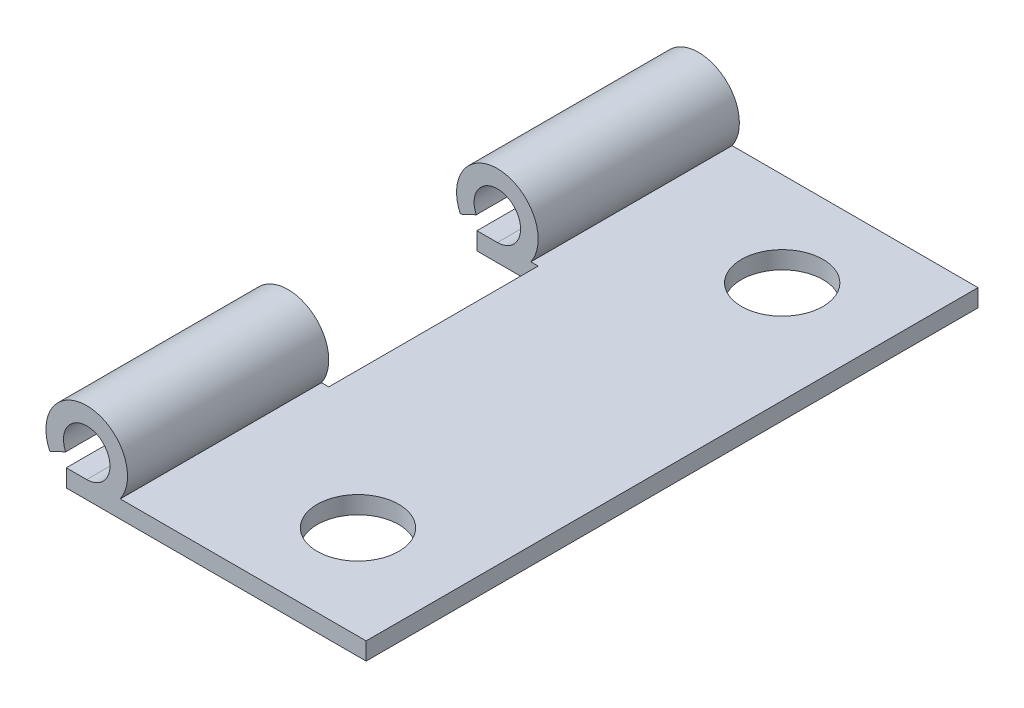
ISO-10303-21;
HEADER;
FILE_DESCRIPTION(('STEP AP214'),'2;1');
FILE_NAME('part.step','',(''),(''),'','','');
FILE_SCHEMA(('AUTOMOTIVE_DESIGN { 1 0 10303 214 1 1 1 1 }'));
ENDSEC;
DATA;
#1=APPLICATION_CONTEXT('core data for automotive mechanical design processes');
#2=APPLICATION_PROTOCOL_DEFINITION('international standard','automotive_design',2000,#1);
#3=PRODUCT_CONTEXT('',#1,'mechanical');
#4=PRODUCT('Part','Part','',(#3));
#5=PRODUCT_RELATED_PRODUCT_CATEGORY('part','',(#4));
#6=PRODUCT_DEFINITION_FORMATION('','',#4);
#7=PRODUCT_DEFINITION_CONTEXT('part definition',#1,'design');
#8=PRODUCT_DEFINITION('design','',#6,#7);
#9=PRODUCT_DEFINITION_SHAPE('','',#8);
#10=(LENGTH_UNIT() NAMED_UNIT(*) SI_UNIT(.MILLI.,.METRE.));
#11=(NAMED_UNIT(*) PLANE_ANGLE_UNIT() SI_UNIT($,.RADIAN.));
#12=(NAMED_UNIT(*) SI_UNIT($,.STERADIAN.) SOLID_ANGLE_UNIT());
#13=UNCERTAINTY_MEASURE_WITH_UNIT(LENGTH_MEASURE(1.E-05),#10,'distance_accuracy_value','');
#14=(GEOMETRIC_REPRESENTATION_CONTEXT(3) GLOBAL_UNCERTAINTY_ASSIGNED_CONTEXT((#13)) GLOBAL_UNIT_ASSIGNED_CONTEXT((#10,
#11,#12)) REPRESENTATION_CONTEXT('',''));
#15=CARTESIAN_POINT('',(0.,0.,0.));
#16=DIRECTION('',(0.,0.,1.));
#17=DIRECTION('',(1.,0.,0.));
#18=AXIS2_PLACEMENT_3D('',#15,#16,#17);
#19=CARTESIAN_POINT('',(0.,1.0922,0.));
#20=DIRECTION('',(0.,1.,0.));
#21=DIRECTION('',(0.,0.,1.));
#22=AXIS2_PLACEMENT_3D('',#19,#20,#21);
#23=PLANE('',#22);
#24=DIRECTION('',(1.,0.,0.));
#25=VECTOR('',#24,1.);
#26=CARTESIAN_POINT('',(0.,1.0922,-25.5693333333333));
#27=LINE('',#26,#25);
#28=CARTESIAN_POINT('',(16.129,1.0922,-25.5693333333333));
#29=VERTEX_POINT('',#28);
#30=CARTESIAN_POINT('',(17.399,1.0922,-25.5693333333333));
#31=VERTEX_POINT('',#30);
#32=EDGE_CURVE('E172',#29,#31,#27,.T.);
#33=ORIENTED_EDGE('',*,*,#32,.T.);
#34=DIRECTION('',(0.,0.,1.));
#35=VECTOR('',#34,1.);
#36=CARTESIAN_POINT('',(17.399,1.0922,-44.5582465762775));
#37=LINE('',#36,#35);
#38=CARTESIAN_POINT('',(17.399,1.0922,-38.1));
#39=VERTEX_POINT('',#38);
#40=EDGE_CURVE('E159',#39,#31,#37,.T.);
#41=ORIENTED_EDGE('',*,*,#40,.F.);
#42=DIRECTION('',(1.,0.,0.));
#43=VECTOR('',#42,1.);
#44=CARTESIAN_POINT('',(0.,1.0922,-38.1));
#45=LINE('',#44,#43);
#46=CARTESIAN_POINT('',(16.129,1.0922,-38.1));
#47=VERTEX_POINT('',#46);
#48=EDGE_CURVE('E171',#47,#39,#45,.T.);
#49=ORIENTED_EDGE('',*,*,#48,.F.);
#50=DIRECTION('',(0.,0.,1.));
#51=VECTOR('',#50,1.);
#52=CARTESIAN_POINT('',(16.129,1.0922,0.));
#53=LINE('',#52,#51);
#54=EDGE_CURVE('E178',#47,#29,#53,.T.);
#55=ORIENTED_EDGE('',*,*,#54,.T.);
#56=EDGE_LOOP('',(#33,#41,#49,#55));
#57=FACE_BOUND('',#56,.T.);
#58=ADVANCED_FACE('F43',(#57),#23,.T.);
#59=CARTESIAN_POINT('',(28.448,1.0922,-5.842));
#60=DIRECTION('',(0.,1.,0.));
#61=DIRECTION('',(0.,0.,1.));
#62=AXIS2_PLACEMENT_3D('',#59,#60,#61);
#63=CIRCLE('',#62,2.54);
#64=CARTESIAN_POINT('',(28.448,1.0922,-3.302));
#65=VERTEX_POINT('',#64);
#66=EDGE_CURVE('E234',#65,#65,#63,.T.);
#67=ORIENTED_EDGE('',*,*,#66,.F.);
#68=EDGE_LOOP('',(#67));
#69=FACE_BOUND('',#68,.T.);
#70=CARTESIAN_POINT('',(28.448,1.0922,-32.258));
#71=DIRECTION('',(0.,1.,0.));
#72=DIRECTION('',(0.,0.,1.));
#73=AXIS2_PLACEMENT_3D('',#70,#71,#72);
#74=CIRCLE('',#73,2.54);
#75=CARTESIAN_POINT('',(28.448,1.0922,-29.718));
#76=VERTEX_POINT('',#75);
#77=EDGE_CURVE('E318',#76,#76,#74,.T.);
#78=ORIENTED_EDGE('',*,*,#77,.F.);
#79=EDGE_LOOP('',(#78));
#80=FACE_BOUND('',#79,.T.);
#81=CARTESIAN_POINT('',(19.4859775178473,1.0922,-38.1));
#82=VERTEX_POINT('',#81);
#83=CARTESIAN_POINT('',(34.798,1.0922,-38.1));
#84=VERTEX_POINT('',#83);
#85=EDGE_CURVE('E179',#82,#84,#45,.T.);
#86=ORIENTED_EDGE('',*,*,#85,.F.);
#87=DIRECTION('',(0.,0.,1.));
#88=VECTOR('',#87,1.);
#89=CARTESIAN_POINT('',(19.4859775178473,1.0922,-44.5582465762775));
#90=LINE('',#89,#88);
#91=CARTESIAN_POINT('',(19.4859775178473,1.0922,-25.5693333333333));
#92=VERTEX_POINT('',#91);
#93=EDGE_CURVE('E173',#82,#92,#90,.T.);
#94=ORIENTED_EDGE('',*,*,#93,.T.);
#95=CARTESIAN_POINT('',(19.939,1.0922,-25.5693333333333));
#96=VERTEX_POINT('',#95);
#97=EDGE_CURVE('E181',#92,#96,#27,.T.);
#98=ORIENTED_EDGE('',*,*,#97,.T.);
#99=DIRECTION('',(0.,0.,1.));
#100=VECTOR('',#99,1.);
#101=CARTESIAN_POINT('',(19.939,1.0922,0.));
#102=LINE('',#101,#100);
#103=CARTESIAN_POINT('',(19.939,1.0922,-12.5306666666667));
#104=VERTEX_POINT('',#103);
#105=EDGE_CURVE('E188',#96,#104,#102,.T.);
#106=ORIENTED_EDGE('',*,*,#105,.T.);
#107=DIRECTION('',(1.,0.,0.));
#108=VECTOR('',#107,1.);
#109=CARTESIAN_POINT('',(0.,1.0922,-12.5306666666667));
#110=LINE('',#109,#108);
#111=CARTESIAN_POINT('',(19.4859775178473,1.0922,-12.5306666666667));
#112=VERTEX_POINT('',#111);
#113=EDGE_CURVE('E191',#112,#104,#110,.T.);
#114=ORIENTED_EDGE('',*,*,#113,.F.);
#115=DIRECTION('',(0.,0.,1.));
#116=VECTOR('',#115,1.);
#117=CARTESIAN_POINT('',(19.4859775178473,1.0922,-18.9889132429442));
#118=LINE('',#117,#116);
#119=CARTESIAN_POINT('',(19.4859775178473,1.0922,0.));
#120=VERTEX_POINT('',#119);
#121=EDGE_CURVE('E303',#112,#120,#118,.T.);
#122=ORIENTED_EDGE('',*,*,#121,.T.);
#123=DIRECTION('',(1.,0.,0.));
#124=VECTOR('',#123,1.);
#125=CARTESIAN_POINT('',(0.,1.0922,0.));
#126=LINE('',#125,#124);
#127=CARTESIAN_POINT('',(34.798,1.0922,0.));
#128=VERTEX_POINT('',#127);
#129=EDGE_CURVE('E198',#120,#128,#126,.T.);
#130=ORIENTED_EDGE('',*,*,#129,.T.);
#131=DIRECTION('',(0.,0.,1.));
#132=VECTOR('',#131,1.);
#133=CARTESIAN_POINT('',(34.798,1.0922,0.));
#134=LINE('',#133,#132);
#135=EDGE_CURVE('E183',#84,#128,#134,.T.);
#136=ORIENTED_EDGE('',*,*,#135,.F.);
#137=EDGE_LOOP('',(#86,#94,#98,#106,#114,#122,#130,#136));
#138=FACE_BOUND('',#137,.T.);
#139=ADVANCED_FACE('F323',(#69,#80,#138),#23,.T.);
#140=DIRECTION('',(0.,0.,1.));
#141=VECTOR('',#140,1.);
#142=CARTESIAN_POINT('',(17.399,1.0922,-18.9889132429442));
#143=LINE('',#142,#141);
#144=CARTESIAN_POINT('',(17.399,1.0922,-12.5306666666667));
#145=VERTEX_POINT('',#144);
#146=CARTESIAN_POINT('',(17.399,1.0922,0.));
#147=VERTEX_POINT('',#146);
#148=EDGE_CURVE('E294',#145,#147,#143,.T.);
#149=ORIENTED_EDGE('',*,*,#148,.F.);
#150=CARTESIAN_POINT('',(16.129,1.0922,-12.5306666666667));
#151=VERTEX_POINT('',#150);
#152=EDGE_CURVE('E192',#151,#145,#110,.T.);
#153=ORIENTED_EDGE('',*,*,#152,.F.);
#154=DIRECTION('',(0.,0.,-1.));
#155=VECTOR('',#154,1.);
#156=CARTESIAN_POINT('',(16.129,1.0922,0.));
#157=LINE('',#156,#155);
#158=CARTESIAN_POINT('',(16.129,1.0922,0.));
#159=VERTEX_POINT('',#158);
#160=EDGE_CURVE('E195',#159,#151,#157,.T.);
#161=ORIENTED_EDGE('',*,*,#160,.F.);
#162=EDGE_CURVE('E199',#159,#147,#126,.T.);
#163=ORIENTED_EDGE('',*,*,#162,.T.);
#164=EDGE_LOOP('',(#149,#153,#161,#163));
#165=FACE_BOUND('',#164,.T.);
#166=ADVANCED_FACE('F341',(#165),#23,.T.);
#167=CARTESIAN_POINT('',(34.798,1.0922,0.));
#168=DIRECTION('',(1.,0.,0.));
#169=DIRECTION('',(0.,0.,-1.));
#170=AXIS2_PLACEMENT_3D('',#167,#168,#169);
#171=PLANE('',#170);
#172=DIRECTION('',(0.,0.,1.));
#173=VECTOR('',#172,1.);
#174=CARTESIAN_POINT('',(34.798,0.,0.));
#175=LINE('',#174,#173);
#176=CARTESIAN_POINT('',(34.798,0.,-38.1));
#177=VERTEX_POINT('',#176);
#178=CARTESIAN_POINT('',(34.798,0.,0.));
#179=VERTEX_POINT('',#178);
#180=EDGE_CURVE('E210',#177,#179,#175,.T.);
#181=ORIENTED_EDGE('',*,*,#180,.F.);
#182=DIRECTION('',(0.,-1.,0.));
#183=VECTOR('',#182,1.);
#184=CARTESIAN_POINT('',(34.798,1.0922,-38.1));
#185=LINE('',#184,#183);
#186=EDGE_CURVE('E12',#84,#177,#185,.T.);
#187=ORIENTED_EDGE('',*,*,#186,.F.);
#188=ORIENTED_EDGE('',*,*,#135,.T.);
#189=DIRECTION('',(0.,-1.,0.));
#190=VECTOR('',#189,1.);
#191=CARTESIAN_POINT('',(34.798,1.0922,0.));
#192=LINE('',#191,#190);
#193=EDGE_CURVE('E202',#128,#179,#192,.T.);
#194=ORIENTED_EDGE('',*,*,#193,.T.);
#195=EDGE_LOOP('',(#181,#187,#188,#194));
#196=FACE_BOUND('',#195,.T.);
#197=ADVANCED_FACE('F259',(#196),#171,.T.);
#198=CARTESIAN_POINT('',(0.,1.0922,-38.1));
#199=DIRECTION('',(0.,0.,-1.));
#200=DIRECTION('',(-1.,0.,0.));
#201=AXIS2_PLACEMENT_3D('',#198,#199,#200);
#202=PLANE('',#201);
#203=DIRECTION('',(1.,0.,0.));
#204=VECTOR('',#203,1.);
#205=CARTESIAN_POINT('',(0.,0.,-38.1));
#206=LINE('',#205,#204);
#207=CARTESIAN_POINT('',(16.129,0.,-38.1));
#208=VERTEX_POINT('',#207);
#209=EDGE_CURVE('E213',#208,#177,#206,.T.);
#210=ORIENTED_EDGE('',*,*,#209,.F.);
#211=DIRECTION('',(0.,-1.,0.));
#212=VECTOR('',#211,1.);
#213=CARTESIAN_POINT('',(16.129,1.0922,-38.1));
#214=LINE('',#213,#212);
#215=EDGE_CURVE('E51',#47,#208,#214,.T.);
#216=ORIENTED_EDGE('',*,*,#215,.F.);
#217=ORIENTED_EDGE('',*,*,#48,.T.);
#218=CARTESIAN_POINT('',(17.399,2.54,-38.1));
#219=DIRECTION('',(0.,0.,-1.));
#220=DIRECTION('',(-1.,0.,0.));
#221=AXIS2_PLACEMENT_3D('',#218,#219,#220);
#222=CIRCLE('',#221,1.4478);
#223=CARTESIAN_POINT('',(16.0868475859283,1.92813328065182,-38.1));
#224=VERTEX_POINT('',#223);
#225=EDGE_CURVE('E155',#224,#39,#222,.T.);
#226=ORIENTED_EDGE('',*,*,#225,.F.);
#227=DIRECTION('',(0.906307787036649,0.422618261740701,0.));
#228=VECTOR('',#227,1.);
#229=CARTESIAN_POINT('',(2.55302961715814,-4.38278968226148,-38.1));
#230=LINE('',#229,#228);
#231=CARTESIAN_POINT('',(15.0969782209269,1.46654961517862,-38.1));
#232=VERTEX_POINT('',#231);
#233=EDGE_CURVE('E287',#232,#224,#230,.T.);
#234=ORIENTED_EDGE('',*,*,#233,.F.);
#235=CARTESIAN_POINT('',(17.399,2.54,-38.1));
#236=DIRECTION('',(0.,0.,-1.));
#237=DIRECTION('',(-1.,0.,0.));
#238=AXIS2_PLACEMENT_3D('',#235,#236,#237);
#239=CIRCLE('',#238,2.54);
#240=EDGE_CURVE('E283',#232,#82,#239,.T.);
#241=ORIENTED_EDGE('',*,*,#240,.T.);
#242=ORIENTED_EDGE('',*,*,#85,.T.);
#243=ORIENTED_EDGE('',*,*,#186,.T.);
#244=EDGE_LOOP('',(#210,#216,#217,#226,#234,#241,#242,#243));
#245=FACE_BOUND('',#244,.T.);
#246=ADVANCED_FACE('F176',(#245),#202,.T.);
#247=CARTESIAN_POINT('',(16.129,1.0922,0.));
#248=DIRECTION('',(1.,0.,0.));
#249=DIRECTION('',(0.,0.,-1.));
#250=AXIS2_PLACEMENT_3D('',#247,#248,#249);
#251=PLANE('',#250);
#252=DIRECTION('',(0.,0.,1.));
#253=VECTOR('',#252,1.);
#254=CARTESIAN_POINT('',(16.129,0.,0.));
#255=LINE('',#254,#253);
#256=CARTESIAN_POINT('',(16.129,0.,-25.5693333333333));
#257=VERTEX_POINT('',#256);
#258=EDGE_CURVE('E216',#208,#257,#255,.T.);
#259=ORIENTED_EDGE('',*,*,#258,.T.);
#260=DIRECTION('',(0.,-1.,0.));
#261=VECTOR('',#260,1.);
#262=CARTESIAN_POINT('',(16.129,1.0922,-25.5693333333333));
#263=LINE('',#262,#261);
#264=EDGE_CURVE('E245',#29,#257,#263,.T.);
#265=ORIENTED_EDGE('',*,*,#264,.F.);
#266=ORIENTED_EDGE('',*,*,#54,.F.);
#267=ORIENTED_EDGE('',*,*,#215,.T.);
#268=EDGE_LOOP('',(#259,#265,#266,#267));
#269=FACE_BOUND('',#268,.T.);
#270=ADVANCED_FACE('F249',(#269),#251,.F.);
#271=CARTESIAN_POINT('',(0.,1.0922,-25.5693333333333));
#272=DIRECTION('',(0.,0.,-1.));
#273=DIRECTION('',(-1.,0.,0.));
#274=AXIS2_PLACEMENT_3D('',#271,#272,#273);
#275=PLANE('',#274);
#276=DIRECTION('',(1.,0.,0.));
#277=VECTOR('',#276,1.);
#278=CARTESIAN_POINT('',(0.,0.,-25.5693333333333));
#279=LINE('',#278,#277);
#280=CARTESIAN_POINT('',(19.939,0.,-25.5693333333333));
#281=VERTEX_POINT('',#280);
#282=EDGE_CURVE('E219',#257,#281,#279,.T.);
#283=ORIENTED_EDGE('',*,*,#282,.T.);
#284=DIRECTION('',(0.,-1.,0.));
#285=VECTOR('',#284,1.);
#286=CARTESIAN_POINT('',(19.939,1.0922,-25.5693333333333));
#287=LINE('',#286,#285);
#288=EDGE_CURVE('E242',#96,#281,#287,.T.);
#289=ORIENTED_EDGE('',*,*,#288,.F.);
#290=ORIENTED_EDGE('',*,*,#97,.F.);
#291=CARTESIAN_POINT('',(17.399,2.54,-25.5693333333333));
#292=DIRECTION('',(0.,0.,-1.));
#293=DIRECTION('',(-1.,0.,0.));
#294=AXIS2_PLACEMENT_3D('',#291,#292,#293);
#295=CIRCLE('',#294,2.54);
#296=CARTESIAN_POINT('',(15.0969782209269,1.46654961517862,-25.5693333333333));
#297=VERTEX_POINT('',#296);
#298=EDGE_CURVE('E58',#297,#92,#295,.T.);
#299=ORIENTED_EDGE('',*,*,#298,.F.);
#300=DIRECTION('',(0.906307787036649,0.422618261740701,0.));
#301=VECTOR('',#300,1.);
#302=CARTESIAN_POINT('',(2.55302961715814,-4.38278968226148,-25.5693333333333));
#303=LINE('',#302,#301);
#304=CARTESIAN_POINT('',(16.0868475859283,1.92813328065182,-25.5693333333333));
#305=VERTEX_POINT('',#304);
#306=EDGE_CURVE('E281',#297,#305,#303,.T.);
#307=ORIENTED_EDGE('',*,*,#306,.T.);
#308=CARTESIAN_POINT('',(17.399,2.54,-25.5693333333333));
#309=DIRECTION('',(0.,0.,-1.));
#310=DIRECTION('',(-1.,0.,0.));
#311=AXIS2_PLACEMENT_3D('',#308,#309,#310);
#312=CIRCLE('',#311,1.4478);
#313=EDGE_CURVE('E165',#305,#31,#312,.T.);
#314=ORIENTED_EDGE('',*,*,#313,.T.);
#315=ORIENTED_EDGE('',*,*,#32,.F.);
#316=ORIENTED_EDGE('',*,*,#264,.T.);
#317=EDGE_LOOP('',(#283,#289,#290,#299,#307,#314,#315,#316));
#318=FACE_BOUND('',#317,.T.);
#319=ADVANCED_FACE('F278',(#318),#275,.F.);
#320=CARTESIAN_POINT('',(19.939,1.0922,0.));
#321=DIRECTION('',(1.,0.,0.));
#322=DIRECTION('',(0.,0.,-1.));
#323=AXIS2_PLACEMENT_3D('',#320,#321,#322);
#324=PLANE('',#323);
#325=DIRECTION('',(0.,0.,1.));
#326=VECTOR('',#325,1.);
#327=CARTESIAN_POINT('',(19.939,0.,0.));
#328=LINE('',#327,#326);
#329=CARTESIAN_POINT('',(19.939,0.,-12.5306666666667));
#330=VERTEX_POINT('',#329);
#331=EDGE_CURVE('E222',#281,#330,#328,.T.);
#332=ORIENTED_EDGE('',*,*,#331,.T.);
#333=DIRECTION('',(0.,-1.,0.));
#334=VECTOR('',#333,1.);
#335=CARTESIAN_POINT('',(19.939,1.0922,-12.5306666666667));
#336=LINE('',#335,#334);
#337=EDGE_CURVE('E240',#104,#330,#336,.T.);
#338=ORIENTED_EDGE('',*,*,#337,.F.);
#339=ORIENTED_EDGE('',*,*,#105,.F.);
#340=ORIENTED_EDGE('',*,*,#288,.T.);
#341=EDGE_LOOP('',(#332,#338,#339,#340));
#342=FACE_BOUND('',#341,.T.);
#343=ADVANCED_FACE('F275',(#342),#324,.F.);
#344=CARTESIAN_POINT('',(0.,1.0922,-12.5306666666667));
#345=DIRECTION('',(0.,0.,-1.));
#346=DIRECTION('',(-1.,0.,0.));
#347=AXIS2_PLACEMENT_3D('',#344,#345,#346);
#348=PLANE('',#347);
#349=DIRECTION('',(1.,0.,0.));
#350=VECTOR('',#349,1.);
#351=CARTESIAN_POINT('',(0.,0.,-12.5306666666667));
#352=LINE('',#351,#350);
#353=CARTESIAN_POINT('',(16.129,0.,-12.5306666666667));
#354=VERTEX_POINT('',#353);
#355=EDGE_CURVE('E225',#354,#330,#352,.T.);
#356=ORIENTED_EDGE('',*,*,#355,.F.);
#357=DIRECTION('',(0.,-1.,0.));
#358=VECTOR('',#357,1.);
#359=CARTESIAN_POINT('',(16.129,1.0922,-12.5306666666667));
#360=LINE('',#359,#358);
#361=EDGE_CURVE('E238',#151,#354,#360,.T.);
#362=ORIENTED_EDGE('',*,*,#361,.F.);
#363=ORIENTED_EDGE('',*,*,#152,.T.);
#364=CARTESIAN_POINT('',(17.399,2.54,-12.5306666666667));
#365=DIRECTION('',(0.,0.,-1.));
#366=DIRECTION('',(-1.,0.,0.));
#367=AXIS2_PLACEMENT_3D('',#364,#365,#366);
#368=CIRCLE('',#367,1.4478);
#369=CARTESIAN_POINT('',(16.0868475859283,1.92813328065182,-12.5306666666667));
#370=VERTEX_POINT('',#369);
#371=EDGE_CURVE('E302',#145,#370,#368,.F.);
#372=ORIENTED_EDGE('',*,*,#371,.T.);
#373=DIRECTION('',(-0.906307787036649,-0.422618261740701,0.));
#374=VECTOR('',#373,1.);
#375=CARTESIAN_POINT('',(2.13469274677086,-4.57786336861166,-12.5306666666667));
#376=LINE('',#375,#374);
#377=CARTESIAN_POINT('',(15.0969782209269,1.46654961517862,-12.5306666666667));
#378=VERTEX_POINT('',#377);
#379=EDGE_CURVE('E207',#370,#378,#376,.T.);
#380=ORIENTED_EDGE('',*,*,#379,.T.);
#381=CARTESIAN_POINT('',(17.399,2.54,-12.5306666666667));
#382=DIRECTION('',(0.,0.,-1.));
#383=DIRECTION('',(-1.,0.,0.));
#384=AXIS2_PLACEMENT_3D('',#381,#382,#383);
#385=CIRCLE('',#384,2.54);
#386=EDGE_CURVE('E66',#112,#378,#385,.F.);
#387=ORIENTED_EDGE('',*,*,#386,.F.);
#388=ORIENTED_EDGE('',*,*,#113,.T.);
#389=ORIENTED_EDGE('',*,*,#337,.T.);
#390=EDGE_LOOP('',(#356,#362,#363,#372,#380,#387,#388,#389));
#391=FACE_BOUND('',#390,.T.);
#392=ADVANCED_FACE('F270',(#391),#348,.T.);
#393=CARTESIAN_POINT('',(16.129,1.0922,0.));
#394=DIRECTION('',(-1.,0.,0.));
#395=DIRECTION('',(0.,0.,1.));
#396=AXIS2_PLACEMENT_3D('',#393,#394,#395);
#397=PLANE('',#396);
#398=DIRECTION('',(0.,0.,-1.));
#399=VECTOR('',#398,1.);
#400=CARTESIAN_POINT('',(16.129,0.,0.));
#401=LINE('',#400,#399);
#402=CARTESIAN_POINT('',(16.129,0.,0.));
#403=VERTEX_POINT('',#402);
#404=EDGE_CURVE('E228',#403,#354,#401,.T.);
#405=ORIENTED_EDGE('',*,*,#404,.F.);
#406=DIRECTION('',(0.,-1.,0.));
#407=VECTOR('',#406,1.);
#408=CARTESIAN_POINT('',(16.129,1.0922,0.));
#409=LINE('',#408,#407);
#410=EDGE_CURVE('E236',#159,#403,#409,.T.);
#411=ORIENTED_EDGE('',*,*,#410,.F.);
#412=ORIENTED_EDGE('',*,*,#160,.T.);
#413=ORIENTED_EDGE('',*,*,#361,.T.);
#414=EDGE_LOOP('',(#405,#411,#412,#413));
#415=FACE_BOUND('',#414,.T.);
#416=ADVANCED_FACE('F265',(#415),#397,.T.);
#417=CARTESIAN_POINT('',(28.448,1.0922,-32.258));
#418=DIRECTION('',(0.,-1.,0.));
#419=DIRECTION('',(0.,0.,-1.));
#420=AXIS2_PLACEMENT_3D('',#417,#418,#419);
#421=CYLINDRICAL_SURFACE('',#420,2.54);
#422=ORIENTED_EDGE('',*,*,#77,.T.);
#423=EDGE_LOOP('',(#422));
#424=FACE_BOUND('',#423,.T.);
#425=CARTESIAN_POINT('',(28.448,0.,-32.258));
#426=DIRECTION('',(0.,1.,0.));
#427=DIRECTION('',(0.,0.,1.));
#428=AXIS2_PLACEMENT_3D('',#425,#426,#427);
#429=CIRCLE('',#428,2.54);
#430=CARTESIAN_POINT('',(28.448,0.,-29.718));
#431=VERTEX_POINT('',#430);
#432=EDGE_CURVE('E206',#431,#431,#429,.T.);
#433=ORIENTED_EDGE('',*,*,#432,.F.);
#434=EDGE_LOOP('',(#433));
#435=FACE_BOUND('',#434,.T.);
#436=ADVANCED_FACE('F336',(#424,#435),#421,.F.);
#437=CARTESIAN_POINT('',(28.448,1.0922,-5.842));
#438=DIRECTION('',(0.,-1.,0.));
#439=DIRECTION('',(0.,0.,-1.));
#440=AXIS2_PLACEMENT_3D('',#437,#438,#439);
#441=CYLINDRICAL_SURFACE('',#440,2.54);
#442=ORIENTED_EDGE('',*,*,#66,.T.);
#443=EDGE_LOOP('',(#442));
#444=FACE_BOUND('',#443,.T.);
#445=CARTESIAN_POINT('',(28.448,0.,-5.842));
#446=DIRECTION('',(0.,1.,0.));
#447=DIRECTION('',(0.,0.,1.));
#448=AXIS2_PLACEMENT_3D('',#445,#446,#447);
#449=CIRCLE('',#448,2.54);
#450=CARTESIAN_POINT('',(28.448,0.,-3.302));
#451=VERTEX_POINT('',#450);
#452=EDGE_CURVE('E203',#451,#451,#449,.T.);
#453=ORIENTED_EDGE('',*,*,#452,.F.);
#454=EDGE_LOOP('',(#453));
#455=FACE_BOUND('',#454,.T.);
#456=ADVANCED_FACE('F45',(#444,#455),#441,.F.);
#457=CARTESIAN_POINT('',(0.,1.0922,0.));
#458=DIRECTION('',(0.,0.,-1.));
#459=DIRECTION('',(-1.,0.,0.));
#460=AXIS2_PLACEMENT_3D('',#457,#458,#459);
#461=PLANE('',#460);
#462=DIRECTION('',(1.,0.,0.));
#463=VECTOR('',#462,1.);
#464=CARTESIAN_POINT('',(0.,0.,0.));
#465=LINE('',#464,#463);
#466=EDGE_CURVE('E231',#403,#179,#465,.T.);
#467=ORIENTED_EDGE('',*,*,#466,.T.);
#468=ORIENTED_EDGE('',*,*,#193,.F.);
#469=ORIENTED_EDGE('',*,*,#129,.F.);
#470=CARTESIAN_POINT('',(17.399,2.54,0.));
#471=DIRECTION('',(0.,0.,1.));
#472=DIRECTION('',(1.,0.,0.));
#473=AXIS2_PLACEMENT_3D('',#470,#471,#472);
#474=CIRCLE('',#473,2.54);
#475=CARTESIAN_POINT('',(15.0969782209269,1.46654961517862,0.));
#476=VERTEX_POINT('',#475);
#477=EDGE_CURVE('E299',#120,#476,#474,.T.);
#478=ORIENTED_EDGE('',*,*,#477,.T.);
#479=DIRECTION('',(-0.906307787036649,-0.422618261740701,0.));
#480=VECTOR('',#479,1.);
#481=CARTESIAN_POINT('',(2.13469274677086,-4.57786336861166,0.));
#482=LINE('',#481,#480);
#483=CARTESIAN_POINT('',(16.0868475859283,1.92813328065182,0.));
#484=VERTEX_POINT('',#483);
#485=EDGE_CURVE('E295',#484,#476,#482,.T.);
#486=ORIENTED_EDGE('',*,*,#485,.F.);
#487=CARTESIAN_POINT('',(17.399,2.54,0.));
#488=DIRECTION('',(0.,0.,1.));
#489=DIRECTION('',(1.,0.,0.));
#490=AXIS2_PLACEMENT_3D('',#487,#488,#489);
#491=CIRCLE('',#490,1.4478);
#492=EDGE_CURVE('E304',#147,#484,#491,.T.);
#493=ORIENTED_EDGE('',*,*,#492,.F.);
#494=ORIENTED_EDGE('',*,*,#162,.F.);
#495=ORIENTED_EDGE('',*,*,#410,.T.);
#496=EDGE_LOOP('',(#467,#468,#469,#478,#486,#493,#494,#495));
#497=FACE_BOUND('',#496,.T.);
#498=ADVANCED_FACE('F326',(#497),#461,.F.);
#499=CARTESIAN_POINT('',(0.,0.,0.));
#500=DIRECTION('',(0.,1.,0.));
#501=DIRECTION('',(0.,0.,1.));
#502=AXIS2_PLACEMENT_3D('',#499,#500,#501);
#503=PLANE('',#502);
#504=ORIENTED_EDGE('',*,*,#452,.T.);
#505=EDGE_LOOP('',(#504));
#506=FACE_BOUND('',#505,.T.);
#507=ORIENTED_EDGE('',*,*,#432,.T.);
#508=EDGE_LOOP('',(#507));
#509=FACE_BOUND('',#508,.T.);
#510=ORIENTED_EDGE('',*,*,#180,.T.);
#511=ORIENTED_EDGE('',*,*,#466,.F.);
#512=ORIENTED_EDGE('',*,*,#404,.T.);
#513=ORIENTED_EDGE('',*,*,#355,.T.);
#514=ORIENTED_EDGE('',*,*,#331,.F.);
#515=ORIENTED_EDGE('',*,*,#282,.F.);
#516=ORIENTED_EDGE('',*,*,#258,.F.);
#517=ORIENTED_EDGE('',*,*,#209,.T.);
#518=EDGE_LOOP('',(#510,#511,#512,#513,#514,#515,#516,#517));
#519=FACE_BOUND('',#518,.T.);
#520=ADVANCED_FACE('F252',(#506,#509,#519),#503,.F.);
#521=CARTESIAN_POINT('',(17.399,2.54,-18.9889132429442));
#522=DIRECTION('',(0.,0.,1.));
#523=DIRECTION('',(1.,0.,0.));
#524=AXIS2_PLACEMENT_3D('',#521,#522,#523);
#525=CYLINDRICAL_SURFACE('',#524,1.4478);
#526=ORIENTED_EDGE('',*,*,#371,.F.);
#527=ORIENTED_EDGE('',*,*,#148,.T.);
#528=ORIENTED_EDGE('',*,*,#492,.T.);
#529=DIRECTION('',(0.,0.,1.));
#530=VECTOR('',#529,1.);
#531=CARTESIAN_POINT('',(16.0868475859283,1.92813328065182,-18.9889132429442));
#532=LINE('',#531,#530);
#533=EDGE_CURVE('E298',#370,#484,#532,.T.);
#534=ORIENTED_EDGE('',*,*,#533,.F.);
#535=EDGE_LOOP('',(#526,#527,#528,#534));
#536=FACE_BOUND('',#535,.T.);
#537=ADVANCED_FACE('F333',(#536),#525,.F.);
#538=CARTESIAN_POINT('',(2.13469274677086,-4.57786336861166,-18.9889132429442));
#539=DIRECTION('',(-0.422618261740701,0.906307787036649,0.));
#540=DIRECTION('',(-0.906307787036649,-0.422618261740701,0.));
#541=AXIS2_PLACEMENT_3D('',#538,#539,#540);
#542=PLANE('',#541);
#543=ORIENTED_EDGE('',*,*,#379,.F.);
#544=ORIENTED_EDGE('',*,*,#533,.T.);
#545=ORIENTED_EDGE('',*,*,#485,.T.);
#546=DIRECTION('',(0.,0.,1.));
#547=VECTOR('',#546,1.);
#548=CARTESIAN_POINT('',(15.0969782209269,1.46654961517862,-18.9889132429442));
#549=LINE('',#548,#547);
#550=EDGE_CURVE('E308',#378,#476,#549,.T.);
#551=ORIENTED_EDGE('',*,*,#550,.F.);
#552=EDGE_LOOP('',(#543,#544,#545,#551));
#553=FACE_BOUND('',#552,.T.);
#554=ADVANCED_FACE('F359',(#553),#542,.F.);
#555=CARTESIAN_POINT('',(17.399,2.54,-18.9889132429442));
#556=DIRECTION('',(0.,0.,1.));
#557=DIRECTION('',(1.,0.,0.));
#558=AXIS2_PLACEMENT_3D('',#555,#556,#557);
#559=CYLINDRICAL_SURFACE('',#558,2.54);
#560=ORIENTED_EDGE('',*,*,#121,.F.);
#561=ORIENTED_EDGE('',*,*,#386,.T.);
#562=ORIENTED_EDGE('',*,*,#550,.T.);
#563=ORIENTED_EDGE('',*,*,#477,.F.);
#564=EDGE_LOOP('',(#560,#561,#562,#563));
#565=FACE_BOUND('',#564,.T.);
#566=ADVANCED_FACE('F362',(#565),#559,.T.);
#567=CARTESIAN_POINT('',(17.399,2.54,-44.5582465762775));
#568=DIRECTION('',(0.,0.,1.));
#569=DIRECTION('',(1.,0.,0.));
#570=AXIS2_PLACEMENT_3D('',#567,#568,#569);
#571=CYLINDRICAL_SURFACE('',#570,1.4478);
#572=DIRECTION('',(0.,0.,1.));
#573=VECTOR('',#572,1.);
#574=CARTESIAN_POINT('',(16.0868475859283,1.92813328065182,-44.5582465762775));
#575=LINE('',#574,#573);
#576=EDGE_CURVE('E161',#224,#305,#575,.T.);
#577=ORIENTED_EDGE('',*,*,#576,.F.);
#578=ORIENTED_EDGE('',*,*,#225,.T.);
#579=ORIENTED_EDGE('',*,*,#40,.T.);
#580=ORIENTED_EDGE('',*,*,#313,.F.);
#581=EDGE_LOOP('',(#577,#578,#579,#580));
#582=FACE_BOUND('',#581,.T.);
#583=ADVANCED_FACE('F157',(#582),#571,.F.);
#584=CARTESIAN_POINT('',(17.399,2.54,-44.5582465762775));
#585=DIRECTION('',(0.,0.,1.));
#586=DIRECTION('',(1.,0.,0.));
#587=AXIS2_PLACEMENT_3D('',#584,#585,#586);
#588=CYLINDRICAL_SURFACE('',#587,2.54);
#589=ORIENTED_EDGE('',*,*,#240,.F.);
#590=DIRECTION('',(0.,0.,1.));
#591=VECTOR('',#590,1.);
#592=CARTESIAN_POINT('',(15.0969782209269,1.46654961517862,-44.5582465762775));
#593=LINE('',#592,#591);
#594=EDGE_CURVE('E290',#232,#297,#593,.T.);
#595=ORIENTED_EDGE('',*,*,#594,.T.);
#596=ORIENTED_EDGE('',*,*,#298,.T.);
#597=ORIENTED_EDGE('',*,*,#93,.F.);
#598=EDGE_LOOP('',(#589,#595,#596,#597));
#599=FACE_BOUND('',#598,.T.);
#600=ADVANCED_FACE('F367',(#599),#588,.T.);
#601=CARTESIAN_POINT('',(2.55302961715814,-4.38278968226148,-44.5582465762775));
#602=DIRECTION('',(0.422618261740701,-0.906307787036649,0.));
#603=DIRECTION('',(0.906307787036649,0.422618261740701,0.));
#604=AXIS2_PLACEMENT_3D('',#601,#602,#603);
#605=PLANE('',#604);
#606=ORIENTED_EDGE('',*,*,#594,.F.);
#607=ORIENTED_EDGE('',*,*,#233,.T.);
#608=ORIENTED_EDGE('',*,*,#576,.T.);
#609=ORIENTED_EDGE('',*,*,#306,.F.);
#610=EDGE_LOOP('',(#606,#607,#608,#609));
#611=FACE_BOUND('',#610,.T.);
#612=ADVANCED_FACE('F365',(#611),#605,.T.);
#613=CLOSED_SHELL('',(#58,#139,#166,#197,#246,#270,#319,#343,#392,#416,#436,#456,#498,#520,#537,
#554,#566,#583,#600,#612));
#614=MANIFOLD_SOLID_BREP('B2',#613);
#615=ADVANCED_BREP_SHAPE_REPRESENTATION('',(#18,#614),#14);
#616=SHAPE_DEFINITION_REPRESENTATION(#9,#615);
ENDSEC;
END-ISO-10303-21;
